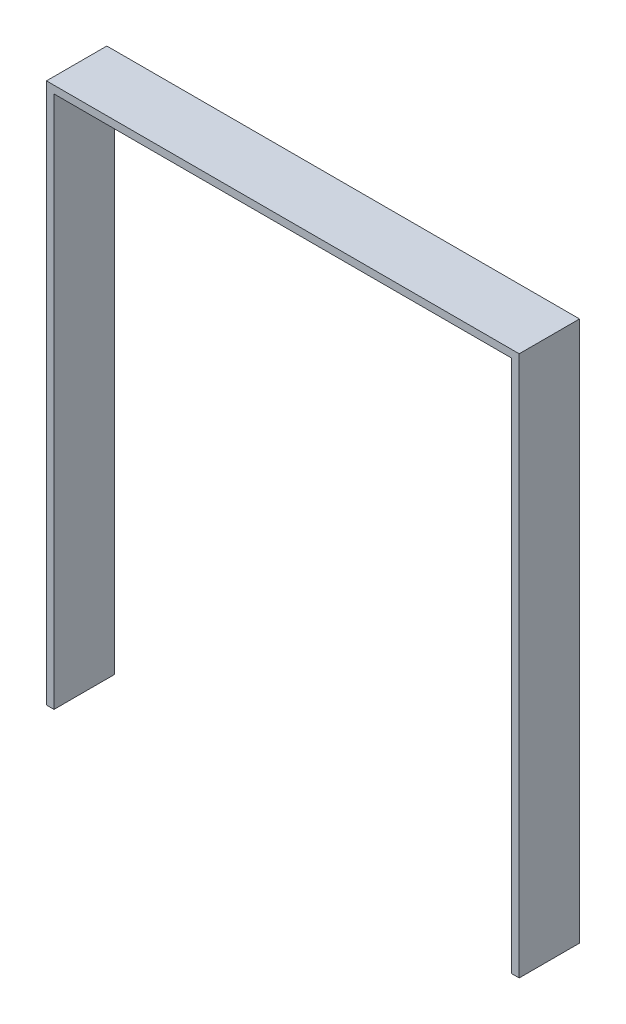
ISO-10303-21;
HEADER;
FILE_DESCRIPTION(('STEP AP214'),'2;1');
FILE_NAME('part.step','',(''),(''),'','','');
FILE_SCHEMA(('AUTOMOTIVE_DESIGN { 1 0 10303 214 1 1 1 1 }'));
ENDSEC;
DATA;
#1=APPLICATION_CONTEXT('core data for automotive mechanical design processes');
#2=APPLICATION_PROTOCOL_DEFINITION('international standard','automotive_design',2000,#1);
#3=PRODUCT_CONTEXT('',#1,'mechanical');
#4=PRODUCT('Part','Part','',(#3));
#5=PRODUCT_RELATED_PRODUCT_CATEGORY('part','',(#4));
#6=PRODUCT_DEFINITION_FORMATION('','',#4);
#7=PRODUCT_DEFINITION_CONTEXT('part definition',#1,'design');
#8=PRODUCT_DEFINITION('design','',#6,#7);
#9=PRODUCT_DEFINITION_SHAPE('','',#8);
#10=(LENGTH_UNIT() NAMED_UNIT(*) SI_UNIT(.MILLI.,.METRE.));
#11=(NAMED_UNIT(*) PLANE_ANGLE_UNIT() SI_UNIT($,.RADIAN.));
#12=(NAMED_UNIT(*) SI_UNIT($,.STERADIAN.) SOLID_ANGLE_UNIT());
#13=UNCERTAINTY_MEASURE_WITH_UNIT(LENGTH_MEASURE(1.E-05),#10,'distance_accuracy_value','');
#14=(GEOMETRIC_REPRESENTATION_CONTEXT(3) GLOBAL_UNCERTAINTY_ASSIGNED_CONTEXT((#13)) GLOBAL_UNIT_ASSIGNED_CONTEXT((#10,
#11,#12)) REPRESENTATION_CONTEXT('',''));
#15=CARTESIAN_POINT('',(0.,0.,0.));
#16=DIRECTION('',(0.,0.,1.));
#17=DIRECTION('',(1.,0.,0.));
#18=AXIS2_PLACEMENT_3D('',#15,#16,#17);
#19=CARTESIAN_POINT('',(0.,0.,24.));
#20=DIRECTION('',(0.,1.,0.));
#21=DIRECTION('',(0.,0.,1.));
#22=AXIS2_PLACEMENT_3D('',#19,#20,#21);
#23=PLANE('',#22);
#24=DIRECTION('',(1.,0.,0.));
#25=VECTOR('',#24,1.);
#26=CARTESIAN_POINT('',(0.,0.,0.));
#27=LINE('',#26,#25);
#28=CARTESIAN_POINT('',(-3.,0.,0.));
#29=VERTEX_POINT('',#28);
#30=CARTESIAN_POINT('',(0.,0.,0.));
#31=VERTEX_POINT('',#30);
#32=EDGE_CURVE('E135',#29,#31,#27,.T.);
#33=ORIENTED_EDGE('',*,*,#32,.T.);
#34=DIRECTION('',(0.,0.,-1.));
#35=VECTOR('',#34,1.);
#36=CARTESIAN_POINT('',(0.,0.,24.));
#37=LINE('',#36,#35);
#38=CARTESIAN_POINT('',(0.,0.,24.));
#39=VERTEX_POINT('',#38);
#40=EDGE_CURVE('E11',#39,#31,#37,.T.);
#41=ORIENTED_EDGE('',*,*,#40,.F.);
#42=DIRECTION('',(1.,0.,0.));
#43=VECTOR('',#42,1.);
#44=CARTESIAN_POINT('',(0.,0.,24.));
#45=LINE('',#44,#43);
#46=CARTESIAN_POINT('',(-3.,0.,24.));
#47=VERTEX_POINT('',#46);
#48=EDGE_CURVE('E149',#47,#39,#45,.T.);
#49=ORIENTED_EDGE('',*,*,#48,.F.);
#50=DIRECTION('',(0.,0.,-1.));
#51=VECTOR('',#50,1.);
#52=CARTESIAN_POINT('',(-3.,0.,24.));
#53=LINE('',#52,#51);
#54=EDGE_CURVE('E131',#47,#29,#53,.T.);
#55=ORIENTED_EDGE('',*,*,#54,.T.);
#56=EDGE_LOOP('',(#33,#41,#49,#55));
#57=FACE_BOUND('',#56,.T.);
#58=ADVANCED_FACE('F39',(#57),#23,.F.);
#59=CARTESIAN_POINT('',(0.,212.,24.));
#60=DIRECTION('',(-1.,0.,0.));
#61=DIRECTION('',(0.,0.,1.));
#62=AXIS2_PLACEMENT_3D('',#59,#60,#61);
#63=PLANE('',#62);
#64=DIRECTION('',(0.,1.,0.));
#65=VECTOR('',#64,1.);
#66=CARTESIAN_POINT('',(0.,212.,0.));
#67=LINE('',#66,#65);
#68=CARTESIAN_POINT('',(0.,212.,0.));
#69=VERTEX_POINT('',#68);
#70=EDGE_CURVE('E138',#31,#69,#67,.T.);
#71=ORIENTED_EDGE('',*,*,#70,.T.);
#72=DIRECTION('',(0.,0.,-1.));
#73=VECTOR('',#72,1.);
#74=CARTESIAN_POINT('',(0.,212.,24.));
#75=LINE('',#74,#73);
#76=CARTESIAN_POINT('',(0.,212.,24.));
#77=VERTEX_POINT('',#76);
#78=EDGE_CURVE('E47',#77,#69,#75,.T.);
#79=ORIENTED_EDGE('',*,*,#78,.F.);
#80=DIRECTION('',(0.,1.,0.));
#81=VECTOR('',#80,1.);
#82=CARTESIAN_POINT('',(0.,212.,24.));
#83=LINE('',#82,#81);
#84=EDGE_CURVE('E98',#39,#77,#83,.T.);
#85=ORIENTED_EDGE('',*,*,#84,.F.);
#86=ORIENTED_EDGE('',*,*,#40,.T.);
#87=EDGE_LOOP('',(#71,#79,#85,#86));
#88=FACE_BOUND('',#87,.T.);
#89=ADVANCED_FACE('F184',(#88),#63,.F.);
#90=CARTESIAN_POINT('',(182.,212.,24.));
#91=DIRECTION('',(0.,1.,0.));
#92=DIRECTION('',(0.,0.,1.));
#93=AXIS2_PLACEMENT_3D('',#90,#91,#92);
#94=PLANE('',#93);
#95=DIRECTION('',(1.,0.,0.));
#96=VECTOR('',#95,1.);
#97=CARTESIAN_POINT('',(182.,212.,0.));
#98=LINE('',#97,#96);
#99=CARTESIAN_POINT('',(182.,212.,0.));
#100=VERTEX_POINT('',#99);
#101=EDGE_CURVE('E140',#69,#100,#98,.T.);
#102=ORIENTED_EDGE('',*,*,#101,.T.);
#103=DIRECTION('',(0.,0.,-1.));
#104=VECTOR('',#103,1.);
#105=CARTESIAN_POINT('',(182.,212.,24.));
#106=LINE('',#105,#104);
#107=CARTESIAN_POINT('',(182.,212.,24.));
#108=VERTEX_POINT('',#107);
#109=EDGE_CURVE('E156',#108,#100,#106,.T.);
#110=ORIENTED_EDGE('',*,*,#109,.F.);
#111=DIRECTION('',(1.,0.,0.));
#112=VECTOR('',#111,1.);
#113=CARTESIAN_POINT('',(182.,212.,24.));
#114=LINE('',#113,#112);
#115=EDGE_CURVE('E164',#77,#108,#114,.T.);
#116=ORIENTED_EDGE('',*,*,#115,.F.);
#117=ORIENTED_EDGE('',*,*,#78,.T.);
#118=EDGE_LOOP('',(#102,#110,#116,#117));
#119=FACE_BOUND('',#118,.T.);
#120=ADVANCED_FACE('F162',(#119),#94,.F.);
#121=CARTESIAN_POINT('',(182.,0.,24.));
#122=DIRECTION('',(1.,0.,0.));
#123=DIRECTION('',(0.,0.,-1.));
#124=AXIS2_PLACEMENT_3D('',#121,#122,#123);
#125=PLANE('',#124);
#126=DIRECTION('',(0.,-1.,0.));
#127=VECTOR('',#126,1.);
#128=CARTESIAN_POINT('',(182.,0.,0.));
#129=LINE('',#128,#127);
#130=CARTESIAN_POINT('',(182.,0.,0.));
#131=VERTEX_POINT('',#130);
#132=EDGE_CURVE('E142',#100,#131,#129,.T.);
#133=ORIENTED_EDGE('',*,*,#132,.T.);
#134=DIRECTION('',(0.,0.,-1.));
#135=VECTOR('',#134,1.);
#136=CARTESIAN_POINT('',(182.,0.,24.));
#137=LINE('',#136,#135);
#138=CARTESIAN_POINT('',(182.,0.,24.));
#139=VERTEX_POINT('',#138);
#140=EDGE_CURVE('E153',#139,#131,#137,.T.);
#141=ORIENTED_EDGE('',*,*,#140,.F.);
#142=DIRECTION('',(0.,-1.,0.));
#143=VECTOR('',#142,1.);
#144=CARTESIAN_POINT('',(182.,0.,24.));
#145=LINE('',#144,#143);
#146=EDGE_CURVE('E176',#108,#139,#145,.T.);
#147=ORIENTED_EDGE('',*,*,#146,.F.);
#148=ORIENTED_EDGE('',*,*,#109,.T.);
#149=EDGE_LOOP('',(#133,#141,#147,#148));
#150=FACE_BOUND('',#149,.T.);
#151=ADVANCED_FACE('F172',(#150),#125,.F.);
#152=CARTESIAN_POINT('',(185.,0.,24.));
#153=DIRECTION('',(0.,1.,0.));
#154=DIRECTION('',(0.,0.,1.));
#155=AXIS2_PLACEMENT_3D('',#152,#153,#154);
#156=PLANE('',#155);
#157=DIRECTION('',(1.,0.,0.));
#158=VECTOR('',#157,1.);
#159=CARTESIAN_POINT('',(185.,0.,0.));
#160=LINE('',#159,#158);
#161=CARTESIAN_POINT('',(185.,0.,0.));
#162=VERTEX_POINT('',#161);
#163=EDGE_CURVE('E144',#131,#162,#160,.T.);
#164=ORIENTED_EDGE('',*,*,#163,.T.);
#165=DIRECTION('',(0.,0.,-1.));
#166=VECTOR('',#165,1.);
#167=CARTESIAN_POINT('',(185.,0.,24.));
#168=LINE('',#167,#166);
#169=CARTESIAN_POINT('',(185.,0.,24.));
#170=VERTEX_POINT('',#169);
#171=EDGE_CURVE('E126',#170,#162,#168,.T.);
#172=ORIENTED_EDGE('',*,*,#171,.F.);
#173=DIRECTION('',(1.,0.,0.));
#174=VECTOR('',#173,1.);
#175=CARTESIAN_POINT('',(185.,0.,24.));
#176=LINE('',#175,#174);
#177=EDGE_CURVE('E117',#139,#170,#176,.T.);
#178=ORIENTED_EDGE('',*,*,#177,.F.);
#179=ORIENTED_EDGE('',*,*,#140,.T.);
#180=EDGE_LOOP('',(#164,#172,#178,#179));
#181=FACE_BOUND('',#180,.T.);
#182=ADVANCED_FACE('F175',(#181),#156,.F.);
#183=CARTESIAN_POINT('',(185.,215.,24.));
#184=DIRECTION('',(-1.,0.,0.));
#185=DIRECTION('',(0.,0.,1.));
#186=AXIS2_PLACEMENT_3D('',#183,#184,#185);
#187=PLANE('',#186);
#188=DIRECTION('',(0.,1.,0.));
#189=VECTOR('',#188,1.);
#190=CARTESIAN_POINT('',(185.,215.,0.));
#191=LINE('',#190,#189);
#192=CARTESIAN_POINT('',(185.,215.,0.));
#193=VERTEX_POINT('',#192);
#194=EDGE_CURVE('E125',#162,#193,#191,.T.);
#195=ORIENTED_EDGE('',*,*,#194,.T.);
#196=DIRECTION('',(0.,0.,-1.));
#197=VECTOR('',#196,1.);
#198=CARTESIAN_POINT('',(185.,215.,24.));
#199=LINE('',#198,#197);
#200=CARTESIAN_POINT('',(185.,215.,24.));
#201=VERTEX_POINT('',#200);
#202=EDGE_CURVE('E122',#201,#193,#199,.T.);
#203=ORIENTED_EDGE('',*,*,#202,.F.);
#204=DIRECTION('',(0.,1.,0.));
#205=VECTOR('',#204,1.);
#206=CARTESIAN_POINT('',(185.,215.,24.));
#207=LINE('',#206,#205);
#208=EDGE_CURVE('E111',#170,#201,#207,.T.);
#209=ORIENTED_EDGE('',*,*,#208,.F.);
#210=ORIENTED_EDGE('',*,*,#171,.T.);
#211=EDGE_LOOP('',(#195,#203,#209,#210));
#212=FACE_BOUND('',#211,.T.);
#213=ADVANCED_FACE('F123',(#212),#187,.F.);
#214=CARTESIAN_POINT('',(-3.,215.,24.));
#215=DIRECTION('',(0.,-1.,0.));
#216=DIRECTION('',(0.,0.,-1.));
#217=AXIS2_PLACEMENT_3D('',#214,#215,#216);
#218=PLANE('',#217);
#219=DIRECTION('',(-1.,0.,0.));
#220=VECTOR('',#219,1.);
#221=CARTESIAN_POINT('',(-3.,215.,0.));
#222=LINE('',#221,#220);
#223=CARTESIAN_POINT('',(-3.,215.,0.));
#224=VERTEX_POINT('',#223);
#225=EDGE_CURVE('E84',#193,#224,#222,.T.);
#226=ORIENTED_EDGE('',*,*,#225,.T.);
#227=DIRECTION('',(0.,0.,-1.));
#228=VECTOR('',#227,1.);
#229=CARTESIAN_POINT('',(-3.,215.,24.));
#230=LINE('',#229,#228);
#231=CARTESIAN_POINT('',(-3.,215.,24.));
#232=VERTEX_POINT('',#231);
#233=EDGE_CURVE('E127',#232,#224,#230,.T.);
#234=ORIENTED_EDGE('',*,*,#233,.F.);
#235=DIRECTION('',(-1.,0.,0.));
#236=VECTOR('',#235,1.);
#237=CARTESIAN_POINT('',(-3.,215.,24.));
#238=LINE('',#237,#236);
#239=EDGE_CURVE('E115',#201,#232,#238,.T.);
#240=ORIENTED_EDGE('',*,*,#239,.F.);
#241=ORIENTED_EDGE('',*,*,#202,.T.);
#242=EDGE_LOOP('',(#226,#234,#240,#241));
#243=FACE_BOUND('',#242,.T.);
#244=ADVANCED_FACE('F129',(#243),#218,.F.);
#245=CARTESIAN_POINT('',(-3.,0.,24.));
#246=DIRECTION('',(1.,0.,0.));
#247=DIRECTION('',(0.,0.,-1.));
#248=AXIS2_PLACEMENT_3D('',#245,#246,#247);
#249=PLANE('',#248);
#250=DIRECTION('',(0.,-1.,0.));
#251=VECTOR('',#250,1.);
#252=CARTESIAN_POINT('',(-3.,0.,0.));
#253=LINE('',#252,#251);
#254=EDGE_CURVE('E90',#224,#29,#253,.T.);
#255=ORIENTED_EDGE('',*,*,#254,.T.);
#256=ORIENTED_EDGE('',*,*,#54,.F.);
#257=DIRECTION('',(0.,-1.,0.));
#258=VECTOR('',#257,1.);
#259=CARTESIAN_POINT('',(-3.,0.,24.));
#260=LINE('',#259,#258);
#261=EDGE_CURVE('E55',#232,#47,#260,.T.);
#262=ORIENTED_EDGE('',*,*,#261,.F.);
#263=ORIENTED_EDGE('',*,*,#233,.T.);
#264=EDGE_LOOP('',(#255,#256,#262,#263));
#265=FACE_BOUND('',#264,.T.);
#266=ADVANCED_FACE('F200',(#265),#249,.F.);
#267=CARTESIAN_POINT('',(0.,0.,24.));
#268=DIRECTION('',(0.,0.,-1.));
#269=DIRECTION('',(-1.,0.,0.));
#270=AXIS2_PLACEMENT_3D('',#267,#268,#269);
#271=PLANE('',#270);
#272=ORIENTED_EDGE('',*,*,#48,.T.);
#273=ORIENTED_EDGE('',*,*,#84,.T.);
#274=ORIENTED_EDGE('',*,*,#115,.T.);
#275=ORIENTED_EDGE('',*,*,#146,.T.);
#276=ORIENTED_EDGE('',*,*,#177,.T.);
#277=ORIENTED_EDGE('',*,*,#208,.T.);
#278=ORIENTED_EDGE('',*,*,#239,.T.);
#279=ORIENTED_EDGE('',*,*,#261,.T.);
#280=EDGE_LOOP('',(#272,#273,#274,#275,#276,#277,#278,#279));
#281=FACE_BOUND('',#280,.T.);
#282=ADVANCED_FACE('F113',(#281),#271,.F.);
#283=CARTESIAN_POINT('',(0.,0.,0.));
#284=DIRECTION('',(0.,0.,-1.));
#285=DIRECTION('',(-1.,0.,0.));
#286=AXIS2_PLACEMENT_3D('',#283,#284,#285);
#287=PLANE('',#286);
#288=ORIENTED_EDGE('',*,*,#32,.F.);
#289=ORIENTED_EDGE('',*,*,#254,.F.);
#290=ORIENTED_EDGE('',*,*,#225,.F.);
#291=ORIENTED_EDGE('',*,*,#194,.F.);
#292=ORIENTED_EDGE('',*,*,#163,.F.);
#293=ORIENTED_EDGE('',*,*,#132,.F.);
#294=ORIENTED_EDGE('',*,*,#101,.F.);
#295=ORIENTED_EDGE('',*,*,#70,.F.);
#296=EDGE_LOOP('',(#288,#289,#290,#291,#292,#293,#294,#295));
#297=FACE_BOUND('',#296,.T.);
#298=ADVANCED_FACE('F168',(#297),#287,.T.);
#299=CLOSED_SHELL('',(#58,#89,#120,#151,#182,#213,#244,#266,#282,#298));
#300=MANIFOLD_SOLID_BREP('B2',#299);
#301=ADVANCED_BREP_SHAPE_REPRESENTATION('',(#18,#300),#14);
#302=SHAPE_DEFINITION_REPRESENTATION(#9,#301);
ENDSEC;
END-ISO-10303-21;
